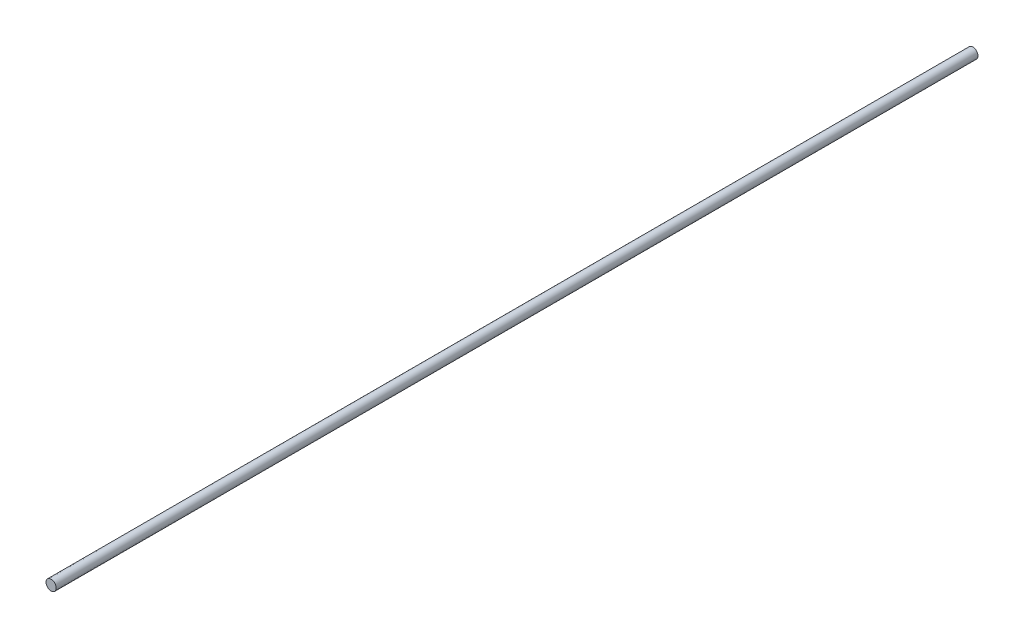
ISO-10303-21;
HEADER;
FILE_DESCRIPTION(('STEP AP214'),'2;1');
FILE_NAME('part.step','',(''),(''),'','','');
FILE_SCHEMA(('AUTOMOTIVE_DESIGN { 1 0 10303 214 1 1 1 1 }'));
ENDSEC;
DATA;
#1=APPLICATION_CONTEXT('core data for automotive mechanical design processes');
#2=APPLICATION_PROTOCOL_DEFINITION('international standard','automotive_design',2000,#1);
#3=PRODUCT_CONTEXT('',#1,'mechanical');
#4=PRODUCT('Part','Part','',(#3));
#5=PRODUCT_RELATED_PRODUCT_CATEGORY('part','',(#4));
#6=PRODUCT_DEFINITION_FORMATION('','',#4);
#7=PRODUCT_DEFINITION_CONTEXT('part definition',#1,'design');
#8=PRODUCT_DEFINITION('design','',#6,#7);
#9=PRODUCT_DEFINITION_SHAPE('','',#8);
#10=(LENGTH_UNIT() NAMED_UNIT(*) SI_UNIT(.MILLI.,.METRE.));
#11=(NAMED_UNIT(*) PLANE_ANGLE_UNIT() SI_UNIT($,.RADIAN.));
#12=(NAMED_UNIT(*) SI_UNIT($,.STERADIAN.) SOLID_ANGLE_UNIT());
#13=UNCERTAINTY_MEASURE_WITH_UNIT(LENGTH_MEASURE(1.E-05),#10,'distance_accuracy_value','');
#14=(GEOMETRIC_REPRESENTATION_CONTEXT(3) GLOBAL_UNCERTAINTY_ASSIGNED_CONTEXT((#13)) GLOBAL_UNIT_ASSIGNED_CONTEXT((#10,
#11,#12)) REPRESENTATION_CONTEXT('',''));
#15=CARTESIAN_POINT('',(0.,0.,0.));
#16=DIRECTION('',(0.,0.,1.));
#17=DIRECTION('',(1.,0.,0.));
#18=AXIS2_PLACEMENT_3D('',#15,#16,#17);
#19=CARTESIAN_POINT('',(0.,0.,900.));
#20=DIRECTION('',(0.,0.,-1.));
#21=DIRECTION('',(-1.,0.,0.));
#22=AXIS2_PLACEMENT_3D('',#19,#20,#21);
#23=CYLINDRICAL_SURFACE('',#22,5.);
#24=CARTESIAN_POINT('',(0.,0.,900.));
#25=DIRECTION('',(0.,0.,1.));
#26=DIRECTION('',(1.,0.,0.));
#27=AXIS2_PLACEMENT_3D('',#24,#25,#26);
#28=CIRCLE('',#27,5.);
#29=CARTESIAN_POINT('',(5.,0.,900.));
#30=VERTEX_POINT('',#29);
#31=EDGE_CURVE('E10',#30,#30,#28,.T.);
#32=ORIENTED_EDGE('',*,*,#31,.F.);
#33=EDGE_LOOP('',(#32));
#34=FACE_BOUND('',#33,.T.);
#35=CARTESIAN_POINT('',(0.,0.,0.));
#36=DIRECTION('',(0.,0.,1.));
#37=DIRECTION('',(1.,0.,0.));
#38=AXIS2_PLACEMENT_3D('',#35,#36,#37);
#39=CIRCLE('',#38,5.);
#40=CARTESIAN_POINT('',(5.,0.,0.));
#41=VERTEX_POINT('',#40);
#42=EDGE_CURVE('E31',#41,#41,#39,.T.);
#43=ORIENTED_EDGE('',*,*,#42,.T.);
#44=EDGE_LOOP('',(#43));
#45=FACE_BOUND('',#44,.T.);
#46=ADVANCED_FACE('F28',(#34,#45),#23,.T.);
#47=CARTESIAN_POINT('',(0.,0.,900.));
#48=DIRECTION('',(0.,0.,1.));
#49=DIRECTION('',(1.,0.,0.));
#50=AXIS2_PLACEMENT_3D('',#47,#48,#49);
#51=PLANE('',#50);
#52=ORIENTED_EDGE('',*,*,#31,.T.);
#53=EDGE_LOOP('',(#52));
#54=FACE_BOUND('',#53,.T.);
#55=ADVANCED_FACE('F43',(#54),#51,.T.);
#56=CARTESIAN_POINT('',(0.,0.,0.));
#57=DIRECTION('',(0.,0.,1.));
#58=DIRECTION('',(1.,0.,0.));
#59=AXIS2_PLACEMENT_3D('',#56,#57,#58);
#60=PLANE('',#59);
#61=ORIENTED_EDGE('',*,*,#42,.F.);
#62=EDGE_LOOP('',(#61));
#63=FACE_BOUND('',#62,.T.);
#64=ADVANCED_FACE('F41',(#63),#60,.F.);
#65=CLOSED_SHELL('',(#46,#55,#64));
#66=MANIFOLD_SOLID_BREP('B2',#65);
#67=ADVANCED_BREP_SHAPE_REPRESENTATION('',(#18,#66),#14);
#68=SHAPE_DEFINITION_REPRESENTATION(#9,#67);
ENDSEC;
END-ISO-10303-21;
